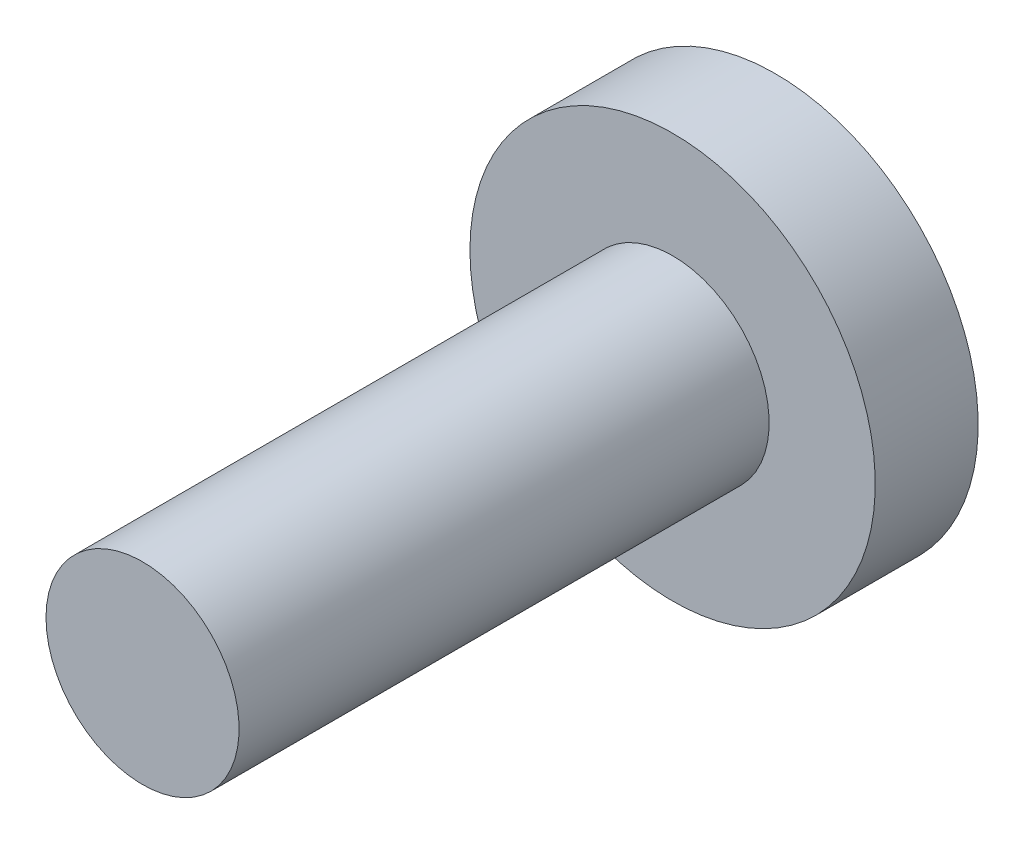
ISO-10303-21;
HEADER;
FILE_DESCRIPTION(('STEP AP214'),'2;1');
FILE_NAME('part.step','',(''),(''),'','','');
FILE_SCHEMA(('AUTOMOTIVE_DESIGN { 1 0 10303 214 1 1 1 1 }'));
ENDSEC;
DATA;
#1=APPLICATION_CONTEXT('core data for automotive mechanical design processes');
#2=APPLICATION_PROTOCOL_DEFINITION('international standard','automotive_design',2000,#1);
#3=PRODUCT_CONTEXT('',#1,'mechanical');
#4=PRODUCT('Part','Part','',(#3));
#5=PRODUCT_RELATED_PRODUCT_CATEGORY('part','',(#4));
#6=PRODUCT_DEFINITION_FORMATION('','',#4);
#7=PRODUCT_DEFINITION_CONTEXT('part definition',#1,'design');
#8=PRODUCT_DEFINITION('design','',#6,#7);
#9=PRODUCT_DEFINITION_SHAPE('','',#8);
#10=(LENGTH_UNIT() NAMED_UNIT(*) SI_UNIT(.MILLI.,.METRE.));
#11=(NAMED_UNIT(*) PLANE_ANGLE_UNIT() SI_UNIT($,.RADIAN.));
#12=(NAMED_UNIT(*) SI_UNIT($,.STERADIAN.) SOLID_ANGLE_UNIT());
#13=UNCERTAINTY_MEASURE_WITH_UNIT(LENGTH_MEASURE(1.E-05),#10,'distance_accuracy_value','');
#14=(GEOMETRIC_REPRESENTATION_CONTEXT(3) GLOBAL_UNCERTAINTY_ASSIGNED_CONTEXT((#13)) GLOBAL_UNIT_ASSIGNED_CONTEXT((#10,
#11,#12)) REPRESENTATION_CONTEXT('',''));
#15=CARTESIAN_POINT('',(0.,0.,0.));
#16=DIRECTION('',(0.,0.,1.));
#17=DIRECTION('',(1.,0.,0.));
#18=AXIS2_PLACEMENT_3D('',#15,#16,#17);
#19=CARTESIAN_POINT('',(25.0063,0.,-45.622531738625));
#20=DIRECTION('',(0.,0.,1.));
#21=DIRECTION('',(1.,0.,0.));
#22=AXIS2_PLACEMENT_3D('',#19,#20,#21);
#23=PLANE('',#22);
#24=CARTESIAN_POINT('',(0.,0.,-45.622531738625));
#25=DIRECTION('',(0.,0.,-1.));
#26=DIRECTION('',(-1.,0.,0.));
#27=AXIS2_PLACEMENT_3D('',#24,#25,#26);
#28=CIRCLE('',#27,25.0063);
#29=CARTESIAN_POINT('',(-25.0063,0.,-45.622531738625));
#30=VERTEX_POINT('',#29);
#31=EDGE_CURVE('E44',#30,#30,#28,.T.);
#32=ORIENTED_EDGE('',*,*,#31,.T.);
#33=EDGE_LOOP('',(#32));
#34=FACE_BOUND('',#33,.T.);
#35=ADVANCED_FACE('F30',(#34),#23,.F.);
#36=CARTESIAN_POINT('',(0.,0.,32.482468261375));
#37=DIRECTION('',(0.,0.,-1.));
#38=DIRECTION('',(-1.,0.,0.));
#39=AXIS2_PLACEMENT_3D('',#36,#37,#38);
#40=PLANE('',#39);
#41=CARTESIAN_POINT('',(0.,0.,32.482468261375));
#42=DIRECTION('',(0.,0.,-1.));
#43=DIRECTION('',(-1.,0.,0.));
#44=AXIS2_PLACEMENT_3D('',#41,#42,#43);
#45=CIRCLE('',#44,11.9126);
#46=CARTESIAN_POINT('',(-11.9126,0.,32.482468261375));
#47=VERTEX_POINT('',#46);
#48=EDGE_CURVE('E10',#47,#47,#45,.T.);
#49=ORIENTED_EDGE('',*,*,#48,.F.);
#50=EDGE_LOOP('',(#49));
#51=FACE_BOUND('',#50,.T.);
#52=ADVANCED_FACE('F64',(#51),#40,.F.);
#53=CARTESIAN_POINT('',(0.,0.,-45.622531738625));
#54=DIRECTION('',(0.,0.,-1.));
#55=DIRECTION('',(-1.,0.,0.));
#56=AXIS2_PLACEMENT_3D('',#53,#54,#55);
#57=CYLINDRICAL_SURFACE('',#56,11.9126);
#58=CARTESIAN_POINT('',(0.,0.,-32.922531738625));
#59=DIRECTION('',(0.,0.,-1.));
#60=DIRECTION('',(-1.,0.,0.));
#61=AXIS2_PLACEMENT_3D('',#58,#59,#60);
#62=CIRCLE('',#61,11.9126);
#63=CARTESIAN_POINT('',(-11.9126,0.,-32.922531738625));
#64=VERTEX_POINT('',#63);
#65=EDGE_CURVE('E36',#64,#64,#62,.T.);
#66=ORIENTED_EDGE('',*,*,#65,.F.);
#67=EDGE_LOOP('',(#66));
#68=FACE_BOUND('',#67,.T.);
#69=ORIENTED_EDGE('',*,*,#48,.T.);
#70=EDGE_LOOP('',(#69));
#71=FACE_BOUND('',#70,.T.);
#72=ADVANCED_FACE('F59',(#68,#71),#57,.T.);
#73=CARTESIAN_POINT('',(11.9126,0.,-32.922531738625));
#74=DIRECTION('',(0.,0.,-1.));
#75=DIRECTION('',(-1.,0.,0.));
#76=AXIS2_PLACEMENT_3D('',#73,#74,#75);
#77=PLANE('',#76);
#78=CARTESIAN_POINT('',(0.,0.,-32.922531738625));
#79=DIRECTION('',(0.,0.,-1.));
#80=DIRECTION('',(-1.,0.,0.));
#81=AXIS2_PLACEMENT_3D('',#78,#79,#80);
#82=CIRCLE('',#81,25.0063);
#83=CARTESIAN_POINT('',(-25.0063,0.,-32.922531738625));
#84=VERTEX_POINT('',#83);
#85=EDGE_CURVE('E40',#84,#84,#82,.T.);
#86=ORIENTED_EDGE('',*,*,#85,.F.);
#87=EDGE_LOOP('',(#86));
#88=FACE_BOUND('',#87,.T.);
#89=ORIENTED_EDGE('',*,*,#65,.T.);
#90=EDGE_LOOP('',(#89));
#91=FACE_BOUND('',#90,.T.);
#92=ADVANCED_FACE('F54',(#88,#91),#77,.F.);
#93=CARTESIAN_POINT('',(0.,0.,-45.622531738625));
#94=DIRECTION('',(0.,0.,-1.));
#95=DIRECTION('',(-1.,0.,0.));
#96=AXIS2_PLACEMENT_3D('',#93,#94,#95);
#97=CYLINDRICAL_SURFACE('',#96,25.0063);
#98=ORIENTED_EDGE('',*,*,#31,.F.);
#99=EDGE_LOOP('',(#98));
#100=FACE_BOUND('',#99,.T.);
#101=ORIENTED_EDGE('',*,*,#85,.T.);
#102=EDGE_LOOP('',(#101));
#103=FACE_BOUND('',#102,.T.);
#104=ADVANCED_FACE('F51',(#100,#103),#97,.T.);
#105=CLOSED_SHELL('',(#35,#52,#72,#92,#104));
#106=MANIFOLD_SOLID_BREP('B2',#105);
#107=ADVANCED_BREP_SHAPE_REPRESENTATION('',(#18,#106),#14);
#108=SHAPE_DEFINITION_REPRESENTATION(#9,#107);
ENDSEC;
END-ISO-10303-21;
